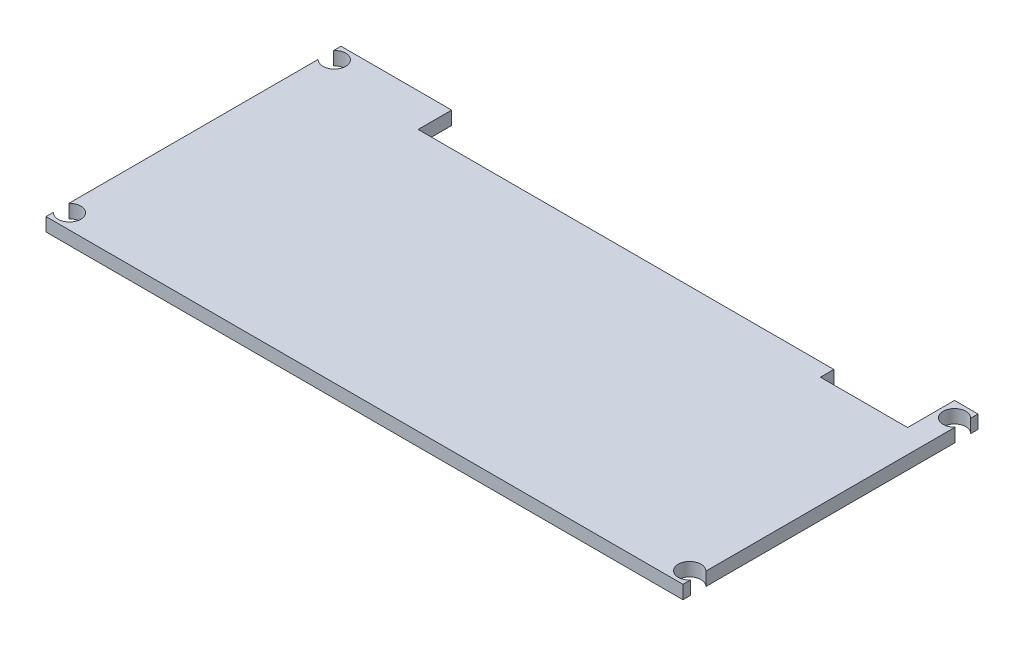
ISO-10303-21;
HEADER;
FILE_DESCRIPTION(('STEP AP214'),'2;1');
FILE_NAME('part.step','',(''),(''),'','','');
FILE_SCHEMA(('AUTOMOTIVE_DESIGN { 1 0 10303 214 1 1 1 1 }'));
ENDSEC;
DATA;
#1=APPLICATION_CONTEXT('core data for automotive mechanical design processes');
#2=APPLICATION_PROTOCOL_DEFINITION('international standard','automotive_design',2000,#1);
#3=PRODUCT_CONTEXT('',#1,'mechanical');
#4=PRODUCT('Part','Part','',(#3));
#5=PRODUCT_RELATED_PRODUCT_CATEGORY('part','',(#4));
#6=PRODUCT_DEFINITION_FORMATION('','',#4);
#7=PRODUCT_DEFINITION_CONTEXT('part definition',#1,'design');
#8=PRODUCT_DEFINITION('design','',#6,#7);
#9=PRODUCT_DEFINITION_SHAPE('','',#8);
#10=(LENGTH_UNIT() NAMED_UNIT(*) SI_UNIT(.MILLI.,.METRE.));
#11=(NAMED_UNIT(*) PLANE_ANGLE_UNIT() SI_UNIT($,.RADIAN.));
#12=(NAMED_UNIT(*) SI_UNIT($,.STERADIAN.) SOLID_ANGLE_UNIT());
#13=UNCERTAINTY_MEASURE_WITH_UNIT(LENGTH_MEASURE(1.E-05),#10,'distance_accuracy_value','');
#14=(GEOMETRIC_REPRESENTATION_CONTEXT(3) GLOBAL_UNCERTAINTY_ASSIGNED_CONTEXT((#13)) GLOBAL_UNIT_ASSIGNED_CONTEXT((#10,
#11,#12)) REPRESENTATION_CONTEXT('',''));
#15=CARTESIAN_POINT('',(0.,0.,0.));
#16=DIRECTION('',(0.,0.,1.));
#17=DIRECTION('',(1.,0.,0.));
#18=AXIS2_PLACEMENT_3D('',#15,#16,#17);
#19=CARTESIAN_POINT('',(-47.5,-8.,22.));
#20=DIRECTION('',(1.,0.,0.));
#21=DIRECTION('',(0.,0.,-1.));
#22=AXIS2_PLACEMENT_3D('',#19,#20,#21);
#23=PLANE('',#22);
#24=DIRECTION('',(0.,0.,1.));
#25=VECTOR('',#24,1.);
#26=CARTESIAN_POINT('',(-47.5,0.,0.));
#27=LINE('',#26,#25);
#28=CARTESIAN_POINT('',(-47.5,0.,-22.));
#29=VERTEX_POINT('',#28);
#30=CARTESIAN_POINT('',(-47.5,0.,-20.9021718621803));
#31=VERTEX_POINT('',#30);
#32=EDGE_CURVE('E335',#29,#31,#27,.T.);
#33=ORIENTED_EDGE('',*,*,#32,.T.);
#34=DIRECTION('',(0.,1.,0.));
#35=VECTOR('',#34,1.);
#36=CARTESIAN_POINT('',(-47.5,-8.,-20.9021718621803));
#37=LINE('',#36,#35);
#38=CARTESIAN_POINT('',(-47.5,2.,-20.9021718621803));
#39=VERTEX_POINT('',#38);
#40=EDGE_CURVE('E14',#31,#39,#37,.T.);
#41=ORIENTED_EDGE('',*,*,#40,.T.);
#42=DIRECTION('',(0.,0.,-1.));
#43=VECTOR('',#42,1.);
#44=CARTESIAN_POINT('',(-47.5,2.,22.));
#45=LINE('',#44,#43);
#46=CARTESIAN_POINT('',(-47.5,2.,-22.));
#47=VERTEX_POINT('',#46);
#48=EDGE_CURVE('E404',#39,#47,#45,.T.);
#49=ORIENTED_EDGE('',*,*,#48,.T.);
#50=DIRECTION('',(0.,1.,0.));
#51=VECTOR('',#50,1.);
#52=CARTESIAN_POINT('',(-47.5,-8.,-22.));
#53=LINE('',#52,#51);
#54=EDGE_CURVE('E261',#29,#47,#53,.T.);
#55=ORIENTED_EDGE('',*,*,#54,.F.);
#56=EDGE_LOOP('',(#33,#41,#49,#55));
#57=FACE_BOUND('',#56,.T.);
#58=ADVANCED_FACE('F79',(#57),#23,.F.);
#59=CARTESIAN_POINT('',(-47.5,2.,18.5978281378197));
#60=VERTEX_POINT('',#59);
#61=CARTESIAN_POINT('',(-47.5,2.,-18.5978281378197));
#62=VERTEX_POINT('',#61);
#63=EDGE_CURVE('E360',#60,#62,#45,.T.);
#64=ORIENTED_EDGE('',*,*,#63,.T.);
#65=DIRECTION('',(0.,1.,0.));
#66=VECTOR('',#65,1.);
#67=CARTESIAN_POINT('',(-47.5,-8.,-18.5978281378197));
#68=LINE('',#67,#66);
#69=CARTESIAN_POINT('',(-47.5,0.,-18.5978281378197));
#70=VERTEX_POINT('',#69);
#71=EDGE_CURVE('E88',#62,#70,#68,.F.);
#72=ORIENTED_EDGE('',*,*,#71,.T.);
#73=CARTESIAN_POINT('',(-47.5,0.,18.5978281378197));
#74=VERTEX_POINT('',#73);
#75=EDGE_CURVE('E339',#70,#74,#27,.T.);
#76=ORIENTED_EDGE('',*,*,#75,.T.);
#77=DIRECTION('',(0.,1.,0.));
#78=VECTOR('',#77,1.);
#79=CARTESIAN_POINT('',(-47.5,-8.,18.5978281378197));
#80=LINE('',#79,#78);
#81=EDGE_CURVE('E350',#74,#60,#80,.T.);
#82=ORIENTED_EDGE('',*,*,#81,.T.);
#83=EDGE_LOOP('',(#64,#72,#76,#82));
#84=FACE_BOUND('',#83,.T.);
#85=ADVANCED_FACE('F358',(#84),#23,.F.);
#86=CARTESIAN_POINT('',(47.5,-8.,22.));
#87=DIRECTION('',(1.,0.,0.));
#88=DIRECTION('',(0.,0.,-1.));
#89=AXIS2_PLACEMENT_3D('',#86,#87,#88);
#90=PLANE('',#89);
#91=DIRECTION('',(0.,1.,0.));
#92=VECTOR('',#91,1.);
#93=CARTESIAN_POINT('',(47.5,-8.,18.5978281378197));
#94=LINE('',#93,#92);
#95=CARTESIAN_POINT('',(47.5,0.,18.5978281378197));
#96=VERTEX_POINT('',#95);
#97=CARTESIAN_POINT('',(47.5,2.,18.5978281378197));
#98=VERTEX_POINT('',#97);
#99=EDGE_CURVE('E344',#96,#98,#94,.T.);
#100=ORIENTED_EDGE('',*,*,#99,.F.);
#101=DIRECTION('',(0.,0.,1.));
#102=VECTOR('',#101,1.);
#103=CARTESIAN_POINT('',(47.5,0.,0.));
#104=LINE('',#103,#102);
#105=CARTESIAN_POINT('',(47.5,0.,-18.5978281378197));
#106=VERTEX_POINT('',#105);
#107=EDGE_CURVE('E334',#106,#96,#104,.T.);
#108=ORIENTED_EDGE('',*,*,#107,.F.);
#109=DIRECTION('',(0.,1.,0.));
#110=VECTOR('',#109,1.);
#111=CARTESIAN_POINT('',(47.5,-8.,-18.5978281378197));
#112=LINE('',#111,#110);
#113=CARTESIAN_POINT('',(47.5,2.,-18.5978281378197));
#114=VERTEX_POINT('',#113);
#115=EDGE_CURVE('E216',#114,#106,#112,.F.);
#116=ORIENTED_EDGE('',*,*,#115,.F.);
#117=DIRECTION('',(0.,0.,-1.));
#118=VECTOR('',#117,1.);
#119=CARTESIAN_POINT('',(47.5,2.,22.));
#120=LINE('',#119,#118);
#121=EDGE_CURVE('E227',#98,#114,#120,.T.);
#122=ORIENTED_EDGE('',*,*,#121,.F.);
#123=EDGE_LOOP('',(#100,#108,#116,#122));
#124=FACE_BOUND('',#123,.T.);
#125=ADVANCED_FACE('F386',(#124),#90,.T.);
#126=DIRECTION('',(0.,1.,0.));
#127=VECTOR('',#126,1.);
#128=CARTESIAN_POINT('',(47.5,-8.,-20.9021718621803));
#129=LINE('',#128,#127);
#130=CARTESIAN_POINT('',(47.5,0.,-20.9021718621803));
#131=VERTEX_POINT('',#130);
#132=CARTESIAN_POINT('',(47.5,2.,-20.9021718621803));
#133=VERTEX_POINT('',#132);
#134=EDGE_CURVE('E204',#131,#133,#129,.T.);
#135=ORIENTED_EDGE('',*,*,#134,.F.);
#136=CARTESIAN_POINT('',(47.5,0.,-22.));
#137=VERTEX_POINT('',#136);
#138=EDGE_CURVE('E330',#137,#131,#104,.T.);
#139=ORIENTED_EDGE('',*,*,#138,.F.);
#140=DIRECTION('',(0.,1.,0.));
#141=VECTOR('',#140,1.);
#142=CARTESIAN_POINT('',(47.5,-8.,-22.));
#143=LINE('',#142,#141);
#144=CARTESIAN_POINT('',(47.5,2.,-22.));
#145=VERTEX_POINT('',#144);
#146=EDGE_CURVE('E234',#137,#145,#143,.T.);
#147=ORIENTED_EDGE('',*,*,#146,.T.);
#148=EDGE_CURVE('E223',#133,#145,#120,.T.);
#149=ORIENTED_EDGE('',*,*,#148,.F.);
#150=EDGE_LOOP('',(#135,#139,#147,#149));
#151=FACE_BOUND('',#150,.T.);
#152=ADVANCED_FACE('F232',(#151),#90,.T.);
#153=CARTESIAN_POINT('',(0.,2.,0.));
#154=DIRECTION('',(0.,-1.,0.));
#155=DIRECTION('',(0.,0.,-1.));
#156=AXIS2_PLACEMENT_3D('',#153,#154,#155);
#157=PLANE('',#156);
#158=CARTESIAN_POINT('',(47.5,2.,22.));
#159=VERTEX_POINT('',#158);
#160=CARTESIAN_POINT('',(47.5,2.,20.9021718621803));
#161=VERTEX_POINT('',#160);
#162=EDGE_CURVE('E239',#159,#161,#120,.T.);
#163=ORIENTED_EDGE('',*,*,#162,.T.);
#164=CARTESIAN_POINT('',(46.25,2.,19.75));
#165=DIRECTION('',(0.,1.,0.));
#166=DIRECTION('',(0.,0.,1.));
#167=AXIS2_PLACEMENT_3D('',#164,#165,#166);
#168=CIRCLE('',#167,1.7);
#169=EDGE_CURVE('E230',#98,#161,#168,.T.);
#170=ORIENTED_EDGE('',*,*,#169,.F.);
#171=ORIENTED_EDGE('',*,*,#121,.T.);
#172=CARTESIAN_POINT('',(46.25,2.,-19.75));
#173=DIRECTION('',(0.,1.,0.));
#174=DIRECTION('',(0.,0.,1.));
#175=AXIS2_PLACEMENT_3D('',#172,#173,#174);
#176=CIRCLE('',#175,1.7);
#177=EDGE_CURVE('E207',#133,#114,#176,.T.);
#178=ORIENTED_EDGE('',*,*,#177,.F.);
#179=ORIENTED_EDGE('',*,*,#148,.T.);
#180=DIRECTION('',(1.,0.,0.));
#181=VECTOR('',#180,1.);
#182=CARTESIAN_POINT('',(-47.5,2.,-22.));
#183=LINE('',#182,#181);
#184=CARTESIAN_POINT('',(44.,2.,-22.));
#185=VERTEX_POINT('',#184);
#186=EDGE_CURVE('E242',#185,#145,#183,.T.);
#187=ORIENTED_EDGE('',*,*,#186,.F.);
#188=DIRECTION('',(0.,0.,1.));
#189=VECTOR('',#188,1.);
#190=CARTESIAN_POINT('',(44.,2.,0.));
#191=LINE('',#190,#189);
#192=CARTESIAN_POINT('',(44.,2.,-15.));
#193=VERTEX_POINT('',#192);
#194=EDGE_CURVE('E288',#185,#193,#191,.T.);
#195=ORIENTED_EDGE('',*,*,#194,.T.);
#196=DIRECTION('',(1.,0.,0.));
#197=VECTOR('',#196,1.);
#198=CARTESIAN_POINT('',(0.,2.,-15.));
#199=LINE('',#198,#197);
#200=CARTESIAN_POINT('',(31.,2.,-15.));
#201=VERTEX_POINT('',#200);
#202=EDGE_CURVE('E284',#201,#193,#199,.T.);
#203=ORIENTED_EDGE('',*,*,#202,.F.);
#204=DIRECTION('',(0.,0.,1.));
#205=VECTOR('',#204,1.);
#206=CARTESIAN_POINT('',(31.,2.,0.));
#207=LINE('',#206,#205);
#208=CARTESIAN_POINT('',(31.,2.,-17.));
#209=VERTEX_POINT('',#208);
#210=EDGE_CURVE('E280',#209,#201,#207,.T.);
#211=ORIENTED_EDGE('',*,*,#210,.F.);
#212=DIRECTION('',(1.,0.,0.));
#213=VECTOR('',#212,1.);
#214=CARTESIAN_POINT('',(0.,2.,-17.));
#215=LINE('',#214,#213);
#216=CARTESIAN_POINT('',(-31.,2.,-17.));
#217=VERTEX_POINT('',#216);
#218=EDGE_CURVE('E276',#217,#209,#215,.T.);
#219=ORIENTED_EDGE('',*,*,#218,.F.);
#220=DIRECTION('',(0.,0.,-1.));
#221=VECTOR('',#220,1.);
#222=CARTESIAN_POINT('',(-31.,2.,0.));
#223=LINE('',#222,#221);
#224=CARTESIAN_POINT('',(-31.,2.,-22.));
#225=VERTEX_POINT('',#224);
#226=EDGE_CURVE('E272',#217,#225,#223,.T.);
#227=ORIENTED_EDGE('',*,*,#226,.T.);
#228=EDGE_CURVE('E237',#47,#225,#183,.T.);
#229=ORIENTED_EDGE('',*,*,#228,.F.);
#230=ORIENTED_EDGE('',*,*,#48,.F.);
#231=CARTESIAN_POINT('',(-46.25,2.,-19.75));
#232=DIRECTION('',(0.,1.,0.));
#233=DIRECTION('',(0.,0.,1.));
#234=AXIS2_PLACEMENT_3D('',#231,#232,#233);
#235=CIRCLE('',#234,1.7);
#236=EDGE_CURVE('E229',#62,#39,#235,.T.);
#237=ORIENTED_EDGE('',*,*,#236,.F.);
#238=ORIENTED_EDGE('',*,*,#63,.F.);
#239=CARTESIAN_POINT('',(-46.25,2.,19.75));
#240=DIRECTION('',(0.,1.,0.));
#241=DIRECTION('',(0.,0.,1.));
#242=AXIS2_PLACEMENT_3D('',#239,#240,#241);
#243=CIRCLE('',#242,1.7);
#244=CARTESIAN_POINT('',(-47.5,2.,20.9021718621803));
#245=VERTEX_POINT('',#244);
#246=EDGE_CURVE('E393',#245,#60,#243,.T.);
#247=ORIENTED_EDGE('',*,*,#246,.F.);
#248=CARTESIAN_POINT('',(-47.5,2.,22.));
#249=VERTEX_POINT('',#248);
#250=EDGE_CURVE('E405',#249,#245,#45,.T.);
#251=ORIENTED_EDGE('',*,*,#250,.F.);
#252=DIRECTION('',(1.,0.,0.));
#253=VECTOR('',#252,1.);
#254=CARTESIAN_POINT('',(-47.5,2.,22.));
#255=LINE('',#254,#253);
#256=EDGE_CURVE('E246',#249,#159,#255,.T.);
#257=ORIENTED_EDGE('',*,*,#256,.T.);
#258=EDGE_LOOP('',(#163,#170,#171,#178,#179,#187,#195,#203,#211,#219,#227,#229,#230,#237,#238,
#247,#251,#257));
#259=FACE_BOUND('',#258,.T.);
#260=ADVANCED_FACE('F221',(#259),#157,.F.);
#261=CARTESIAN_POINT('',(0.,0.,0.));
#262=DIRECTION('',(0.,-1.,0.));
#263=DIRECTION('',(0.,0.,-1.));
#264=AXIS2_PLACEMENT_3D('',#261,#262,#263);
#265=PLANE('',#264);
#266=CARTESIAN_POINT('',(46.25,0.,19.75));
#267=DIRECTION('',(0.,-1.,0.));
#268=DIRECTION('',(0.,0.,-1.));
#269=AXIS2_PLACEMENT_3D('',#266,#267,#268);
#270=CIRCLE('',#269,1.7);
#271=CARTESIAN_POINT('',(47.5,0.,20.9021718621803));
#272=VERTEX_POINT('',#271);
#273=EDGE_CURVE('E378',#272,#96,#270,.T.);
#274=ORIENTED_EDGE('',*,*,#273,.F.);
#275=CARTESIAN_POINT('',(47.5,0.,22.));
#276=VERTEX_POINT('',#275);
#277=EDGE_CURVE('E329',#272,#276,#104,.T.);
#278=ORIENTED_EDGE('',*,*,#277,.T.);
#279=DIRECTION('',(-1.,0.,0.));
#280=VECTOR('',#279,1.);
#281=CARTESIAN_POINT('',(0.,0.,22.));
#282=LINE('',#281,#280);
#283=CARTESIAN_POINT('',(-47.5,0.,22.));
#284=VERTEX_POINT('',#283);
#285=EDGE_CURVE('E325',#276,#284,#282,.T.);
#286=ORIENTED_EDGE('',*,*,#285,.T.);
#287=CARTESIAN_POINT('',(-47.5,0.,20.9021718621803));
#288=VERTEX_POINT('',#287);
#289=EDGE_CURVE('E333',#288,#284,#27,.T.);
#290=ORIENTED_EDGE('',*,*,#289,.F.);
#291=CARTESIAN_POINT('',(-46.25,0.,19.75));
#292=DIRECTION('',(0.,-1.,0.));
#293=DIRECTION('',(0.,0.,-1.));
#294=AXIS2_PLACEMENT_3D('',#291,#292,#293);
#295=CIRCLE('',#294,1.7);
#296=EDGE_CURVE('E95',#74,#288,#295,.T.);
#297=ORIENTED_EDGE('',*,*,#296,.F.);
#298=ORIENTED_EDGE('',*,*,#75,.F.);
#299=CARTESIAN_POINT('',(-46.25,0.,-19.75));
#300=DIRECTION('',(0.,-1.,0.));
#301=DIRECTION('',(0.,0.,-1.));
#302=AXIS2_PLACEMENT_3D('',#299,#300,#301);
#303=CIRCLE('',#302,1.7);
#304=EDGE_CURVE('E103',#31,#70,#303,.T.);
#305=ORIENTED_EDGE('',*,*,#304,.F.);
#306=ORIENTED_EDGE('',*,*,#32,.F.);
#307=DIRECTION('',(-1.,0.,0.));
#308=VECTOR('',#307,1.);
#309=CARTESIAN_POINT('',(0.,0.,-22.));
#310=LINE('',#309,#308);
#311=CARTESIAN_POINT('',(-31.,0.,-22.));
#312=VERTEX_POINT('',#311);
#313=EDGE_CURVE('E269',#312,#29,#310,.T.);
#314=ORIENTED_EDGE('',*,*,#313,.F.);
#315=DIRECTION('',(0.,0.,1.));
#316=VECTOR('',#315,1.);
#317=CARTESIAN_POINT('',(-31.,0.,0.));
#318=LINE('',#317,#316);
#319=CARTESIAN_POINT('',(-31.,0.,-17.));
#320=VERTEX_POINT('',#319);
#321=EDGE_CURVE('E319',#312,#320,#318,.T.);
#322=ORIENTED_EDGE('',*,*,#321,.T.);
#323=DIRECTION('',(-1.,0.,0.));
#324=VECTOR('',#323,1.);
#325=CARTESIAN_POINT('',(0.,0.,-17.));
#326=LINE('',#325,#324);
#327=CARTESIAN_POINT('',(31.,0.,-17.));
#328=VERTEX_POINT('',#327);
#329=EDGE_CURVE('E296',#328,#320,#326,.T.);
#330=ORIENTED_EDGE('',*,*,#329,.F.);
#331=DIRECTION('',(0.,0.,-1.));
#332=VECTOR('',#331,1.);
#333=CARTESIAN_POINT('',(31.,0.,0.));
#334=LINE('',#333,#332);
#335=CARTESIAN_POINT('',(31.,0.,-15.));
#336=VERTEX_POINT('',#335);
#337=EDGE_CURVE('E308',#336,#328,#334,.T.);
#338=ORIENTED_EDGE('',*,*,#337,.F.);
#339=DIRECTION('',(-1.,0.,0.));
#340=VECTOR('',#339,1.);
#341=CARTESIAN_POINT('',(0.,0.,-15.));
#342=LINE('',#341,#340);
#343=CARTESIAN_POINT('',(44.,0.,-15.));
#344=VERTEX_POINT('',#343);
#345=EDGE_CURVE('E312',#344,#336,#342,.T.);
#346=ORIENTED_EDGE('',*,*,#345,.F.);
#347=DIRECTION('',(0.,0.,-1.));
#348=VECTOR('',#347,1.);
#349=CARTESIAN_POINT('',(44.,0.,0.));
#350=LINE('',#349,#348);
#351=CARTESIAN_POINT('',(44.,0.,-22.));
#352=VERTEX_POINT('',#351);
#353=EDGE_CURVE('E315',#344,#352,#350,.T.);
#354=ORIENTED_EDGE('',*,*,#353,.T.);
#355=EDGE_CURVE('E265',#137,#352,#310,.T.);
#356=ORIENTED_EDGE('',*,*,#355,.F.);
#357=ORIENTED_EDGE('',*,*,#138,.T.);
#358=CARTESIAN_POINT('',(46.25,0.,-19.75));
#359=DIRECTION('',(0.,-1.,0.));
#360=DIRECTION('',(0.,0.,-1.));
#361=AXIS2_PLACEMENT_3D('',#358,#359,#360);
#362=CIRCLE('',#361,1.7);
#363=EDGE_CURVE('E210',#106,#131,#362,.T.);
#364=ORIENTED_EDGE('',*,*,#363,.F.);
#365=ORIENTED_EDGE('',*,*,#107,.T.);
#366=EDGE_LOOP('',(#274,#278,#286,#290,#297,#298,#305,#306,#314,#322,#330,#338,#346,#354,#356,
#357,#364,#365));
#367=FACE_BOUND('',#366,.T.);
#368=ADVANCED_FACE('F81',(#367),#265,.T.);
#369=CARTESIAN_POINT('',(-31.,-2.,0.));
#370=DIRECTION('',(1.,0.,0.));
#371=DIRECTION('',(0.,0.,-1.));
#372=AXIS2_PLACEMENT_3D('',#369,#370,#371);
#373=PLANE('',#372);
#374=DIRECTION('',(0.,-1.,0.));
#375=VECTOR('',#374,1.);
#376=CARTESIAN_POINT('',(-31.,-2.,-22.));
#377=LINE('',#376,#375);
#378=EDGE_CURVE('E268',#225,#312,#377,.T.);
#379=ORIENTED_EDGE('',*,*,#378,.F.);
#380=ORIENTED_EDGE('',*,*,#226,.F.);
#381=DIRECTION('',(0.,1.,0.));
#382=VECTOR('',#381,1.);
#383=CARTESIAN_POINT('',(-31.,-2.,-17.));
#384=LINE('',#383,#382);
#385=EDGE_CURVE('E291',#320,#217,#384,.T.);
#386=ORIENTED_EDGE('',*,*,#385,.F.);
#387=ORIENTED_EDGE('',*,*,#321,.F.);
#388=EDGE_LOOP('',(#379,#380,#386,#387));
#389=FACE_BOUND('',#388,.T.);
#390=ADVANCED_FACE('F423',(#389),#373,.T.);
#391=CARTESIAN_POINT('',(44.,-2.,0.));
#392=DIRECTION('',(-1.,0.,0.));
#393=DIRECTION('',(0.,0.,1.));
#394=AXIS2_PLACEMENT_3D('',#391,#392,#393);
#395=PLANE('',#394);
#396=DIRECTION('',(0.,1.,0.));
#397=VECTOR('',#396,1.);
#398=CARTESIAN_POINT('',(44.,-2.,-22.));
#399=LINE('',#398,#397);
#400=EDGE_CURVE('E322',#352,#185,#399,.T.);
#401=ORIENTED_EDGE('',*,*,#400,.F.);
#402=ORIENTED_EDGE('',*,*,#353,.F.);
#403=DIRECTION('',(0.,1.,0.));
#404=VECTOR('',#403,1.);
#405=CARTESIAN_POINT('',(44.,-2.,-15.));
#406=LINE('',#405,#404);
#407=EDGE_CURVE('E292',#344,#193,#406,.T.);
#408=ORIENTED_EDGE('',*,*,#407,.T.);
#409=ORIENTED_EDGE('',*,*,#194,.F.);
#410=EDGE_LOOP('',(#401,#402,#408,#409));
#411=FACE_BOUND('',#410,.T.);
#412=ADVANCED_FACE('F442',(#411),#395,.T.);
#413=CARTESIAN_POINT('',(0.,-2.,-15.));
#414=DIRECTION('',(0.,0.,1.));
#415=DIRECTION('',(1.,0.,0.));
#416=AXIS2_PLACEMENT_3D('',#413,#414,#415);
#417=PLANE('',#416);
#418=ORIENTED_EDGE('',*,*,#345,.T.);
#419=DIRECTION('',(0.,1.,0.));
#420=VECTOR('',#419,1.);
#421=CARTESIAN_POINT('',(31.,-2.,-15.));
#422=LINE('',#421,#420);
#423=EDGE_CURVE('E297',#336,#201,#422,.T.);
#424=ORIENTED_EDGE('',*,*,#423,.T.);
#425=ORIENTED_EDGE('',*,*,#202,.T.);
#426=ORIENTED_EDGE('',*,*,#407,.F.);
#427=EDGE_LOOP('',(#418,#424,#425,#426));
#428=FACE_BOUND('',#427,.T.);
#429=ADVANCED_FACE('F437',(#428),#417,.F.);
#430=CARTESIAN_POINT('',(31.,-2.,0.));
#431=DIRECTION('',(-1.,0.,0.));
#432=DIRECTION('',(0.,0.,1.));
#433=AXIS2_PLACEMENT_3D('',#430,#431,#432);
#434=PLANE('',#433);
#435=ORIENTED_EDGE('',*,*,#337,.T.);
#436=DIRECTION('',(0.,1.,0.));
#437=VECTOR('',#436,1.);
#438=CARTESIAN_POINT('',(31.,-2.,-17.));
#439=LINE('',#438,#437);
#440=EDGE_CURVE('E300',#328,#209,#439,.T.);
#441=ORIENTED_EDGE('',*,*,#440,.T.);
#442=ORIENTED_EDGE('',*,*,#210,.T.);
#443=ORIENTED_EDGE('',*,*,#423,.F.);
#444=EDGE_LOOP('',(#435,#441,#442,#443));
#445=FACE_BOUND('',#444,.T.);
#446=ADVANCED_FACE('F432',(#445),#434,.F.);
#447=CARTESIAN_POINT('',(0.,-2.,-17.));
#448=DIRECTION('',(0.,0.,1.));
#449=DIRECTION('',(1.,0.,0.));
#450=AXIS2_PLACEMENT_3D('',#447,#448,#449);
#451=PLANE('',#450);
#452=ORIENTED_EDGE('',*,*,#329,.T.);
#453=ORIENTED_EDGE('',*,*,#385,.T.);
#454=ORIENTED_EDGE('',*,*,#218,.T.);
#455=ORIENTED_EDGE('',*,*,#440,.F.);
#456=EDGE_LOOP('',(#452,#453,#454,#455));
#457=FACE_BOUND('',#456,.T.);
#458=ADVANCED_FACE('F429',(#457),#451,.F.);
#459=CARTESIAN_POINT('',(-47.5,-8.,-22.));
#460=DIRECTION('',(0.,0.,1.));
#461=DIRECTION('',(1.,0.,0.));
#462=AXIS2_PLACEMENT_3D('',#459,#460,#461);
#463=PLANE('',#462);
#464=ORIENTED_EDGE('',*,*,#313,.T.);
#465=ORIENTED_EDGE('',*,*,#54,.T.);
#466=ORIENTED_EDGE('',*,*,#228,.T.);
#467=ORIENTED_EDGE('',*,*,#378,.T.);
#468=EDGE_LOOP('',(#464,#465,#466,#467));
#469=FACE_BOUND('',#468,.T.);
#470=ADVANCED_FACE('F415',(#469),#463,.F.);
#471=ORIENTED_EDGE('',*,*,#250,.T.);
#472=DIRECTION('',(0.,1.,0.));
#473=VECTOR('',#472,1.);
#474=CARTESIAN_POINT('',(-47.5,-8.,20.9021718621803));
#475=LINE('',#474,#473);
#476=EDGE_CURVE('E347',#245,#288,#475,.F.);
#477=ORIENTED_EDGE('',*,*,#476,.T.);
#478=ORIENTED_EDGE('',*,*,#289,.T.);
#479=DIRECTION('',(0.,1.,0.));
#480=VECTOR('',#479,1.);
#481=CARTESIAN_POINT('',(-47.5,-8.,22.));
#482=LINE('',#481,#480);
#483=EDGE_CURVE('E250',#284,#249,#482,.T.);
#484=ORIENTED_EDGE('',*,*,#483,.T.);
#485=EDGE_LOOP('',(#471,#477,#478,#484));
#486=FACE_BOUND('',#485,.T.);
#487=ADVANCED_FACE('F371',(#486),#23,.F.);
#488=ORIENTED_EDGE('',*,*,#355,.T.);
#489=ORIENTED_EDGE('',*,*,#400,.T.);
#490=ORIENTED_EDGE('',*,*,#186,.T.);
#491=ORIENTED_EDGE('',*,*,#146,.F.);
#492=EDGE_LOOP('',(#488,#489,#490,#491));
#493=FACE_BOUND('',#492,.T.);
#494=ADVANCED_FACE('F444',(#493),#463,.F.);
#495=DIRECTION('',(0.,1.,0.));
#496=VECTOR('',#495,1.);
#497=CARTESIAN_POINT('',(47.5,-8.,20.9021718621803));
#498=LINE('',#497,#496);
#499=EDGE_CURVE('E215',#161,#272,#498,.F.);
#500=ORIENTED_EDGE('',*,*,#499,.F.);
#501=ORIENTED_EDGE('',*,*,#162,.F.);
#502=DIRECTION('',(0.,1.,0.));
#503=VECTOR('',#502,1.);
#504=CARTESIAN_POINT('',(47.5,-8.,22.));
#505=LINE('',#504,#503);
#506=EDGE_CURVE('E254',#276,#159,#505,.T.);
#507=ORIENTED_EDGE('',*,*,#506,.F.);
#508=ORIENTED_EDGE('',*,*,#277,.F.);
#509=EDGE_LOOP('',(#500,#501,#507,#508));
#510=FACE_BOUND('',#509,.T.);
#511=ADVANCED_FACE('F446',(#510),#90,.T.);
#512=CARTESIAN_POINT('',(-47.5,-8.,22.));
#513=DIRECTION('',(0.,0.,1.));
#514=DIRECTION('',(1.,0.,0.));
#515=AXIS2_PLACEMENT_3D('',#512,#513,#514);
#516=PLANE('',#515);
#517=ORIENTED_EDGE('',*,*,#506,.T.);
#518=ORIENTED_EDGE('',*,*,#256,.F.);
#519=ORIENTED_EDGE('',*,*,#483,.F.);
#520=ORIENTED_EDGE('',*,*,#285,.F.);
#521=EDGE_LOOP('',(#517,#518,#519,#520));
#522=FACE_BOUND('',#521,.T.);
#523=ADVANCED_FACE('F374',(#522),#516,.T.);
#524=CARTESIAN_POINT('',(46.25,-8.,-19.75));
#525=DIRECTION('',(0.,1.,0.));
#526=DIRECTION('',(0.,0.,1.));
#527=AXIS2_PLACEMENT_3D('',#524,#525,#526);
#528=CYLINDRICAL_SURFACE('',#527,1.7);
#529=ORIENTED_EDGE('',*,*,#134,.T.);
#530=ORIENTED_EDGE('',*,*,#177,.T.);
#531=ORIENTED_EDGE('',*,*,#115,.T.);
#532=ORIENTED_EDGE('',*,*,#363,.T.);
#533=EDGE_LOOP('',(#529,#530,#531,#532));
#534=FACE_BOUND('',#533,.T.);
#535=ADVANCED_FACE('F206',(#534),#528,.F.);
#536=CARTESIAN_POINT('',(46.25,-8.,19.75));
#537=DIRECTION('',(0.,1.,0.));
#538=DIRECTION('',(0.,0.,1.));
#539=AXIS2_PLACEMENT_3D('',#536,#537,#538);
#540=CYLINDRICAL_SURFACE('',#539,1.7);
#541=ORIENTED_EDGE('',*,*,#99,.T.);
#542=ORIENTED_EDGE('',*,*,#169,.T.);
#543=ORIENTED_EDGE('',*,*,#499,.T.);
#544=ORIENTED_EDGE('',*,*,#273,.T.);
#545=EDGE_LOOP('',(#541,#542,#543,#544));
#546=FACE_BOUND('',#545,.T.);
#547=ADVANCED_FACE('F388',(#546),#540,.F.);
#548=CARTESIAN_POINT('',(-46.25,-8.,19.75));
#549=DIRECTION('',(0.,1.,0.));
#550=DIRECTION('',(0.,0.,1.));
#551=AXIS2_PLACEMENT_3D('',#548,#549,#550);
#552=CYLINDRICAL_SURFACE('',#551,1.7);
#553=ORIENTED_EDGE('',*,*,#296,.T.);
#554=ORIENTED_EDGE('',*,*,#476,.F.);
#555=ORIENTED_EDGE('',*,*,#246,.T.);
#556=ORIENTED_EDGE('',*,*,#81,.F.);
#557=EDGE_LOOP('',(#553,#554,#555,#556));
#558=FACE_BOUND('',#557,.T.);
#559=ADVANCED_FACE('F483',(#558),#552,.F.);
#560=CARTESIAN_POINT('',(-46.25,-8.,-19.75));
#561=DIRECTION('',(0.,1.,0.));
#562=DIRECTION('',(0.,0.,1.));
#563=AXIS2_PLACEMENT_3D('',#560,#561,#562);
#564=CYLINDRICAL_SURFACE('',#563,1.7);
#565=ORIENTED_EDGE('',*,*,#304,.T.);
#566=ORIENTED_EDGE('',*,*,#71,.F.);
#567=ORIENTED_EDGE('',*,*,#236,.T.);
#568=ORIENTED_EDGE('',*,*,#40,.F.);
#569=EDGE_LOOP('',(#565,#566,#567,#568));
#570=FACE_BOUND('',#569,.T.);
#571=ADVANCED_FACE('F486',(#570),#564,.F.);
#572=CLOSED_SHELL('',(#58,#85,#125,#152,#260,#368,#390,#412,#429,#446,#458,#470,#487,#494,#511,
#523,#535,#547,#559,#571));
#573=MANIFOLD_SOLID_BREP('B2',#572);
#574=ADVANCED_BREP_SHAPE_REPRESENTATION('',(#18,#573),#14);
#575=SHAPE_DEFINITION_REPRESENTATION(#9,#574);
ENDSEC;
END-ISO-10303-21;
